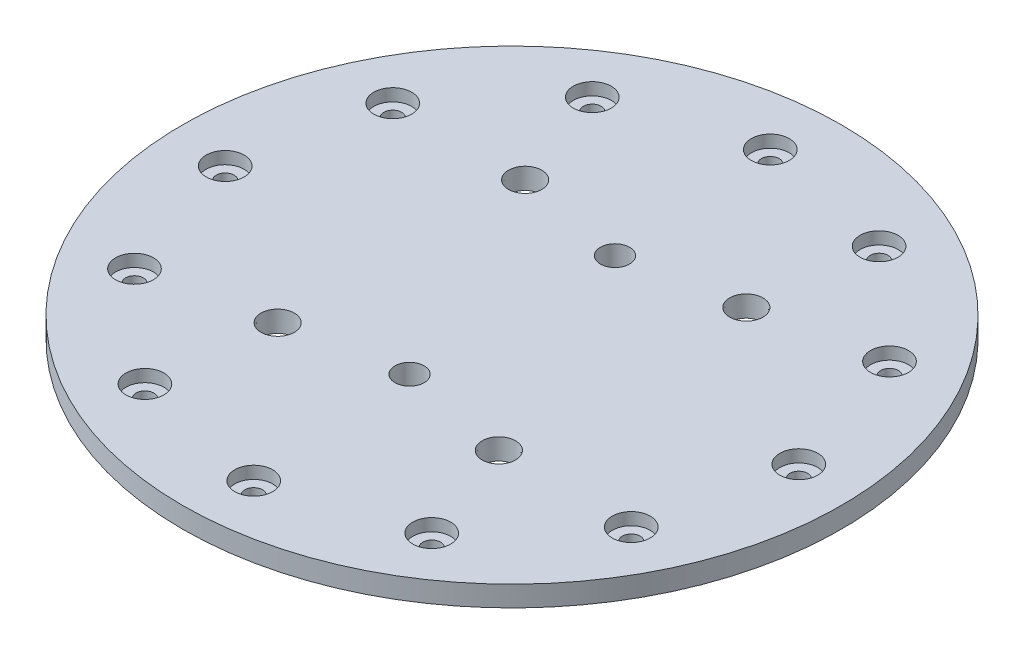
ISO-10303-21;
HEADER;
FILE_DESCRIPTION(('STEP AP214'),'2;1');
FILE_NAME('part.step','',(''),(''),'','','');
FILE_SCHEMA(('AUTOMOTIVE_DESIGN { 1 0 10303 214 1 1 1 1 }'));
ENDSEC;
DATA;
#1=APPLICATION_CONTEXT('core data for automotive mechanical design processes');
#2=APPLICATION_PROTOCOL_DEFINITION('international standard','automotive_design',2000,#1);
#3=PRODUCT_CONTEXT('',#1,'mechanical');
#4=PRODUCT('Part','Part','',(#3));
#5=PRODUCT_RELATED_PRODUCT_CATEGORY('part','',(#4));
#6=PRODUCT_DEFINITION_FORMATION('','',#4);
#7=PRODUCT_DEFINITION_CONTEXT('part definition',#1,'design');
#8=PRODUCT_DEFINITION('design','',#6,#7);
#9=PRODUCT_DEFINITION_SHAPE('','',#8);
#10=(LENGTH_UNIT() NAMED_UNIT(*) SI_UNIT(.MILLI.,.METRE.));
#11=(NAMED_UNIT(*) PLANE_ANGLE_UNIT() SI_UNIT($,.RADIAN.));
#12=(NAMED_UNIT(*) SI_UNIT($,.STERADIAN.) SOLID_ANGLE_UNIT());
#13=UNCERTAINTY_MEASURE_WITH_UNIT(LENGTH_MEASURE(1.E-05),#10,'distance_accuracy_value','');
#14=(GEOMETRIC_REPRESENTATION_CONTEXT(3) GLOBAL_UNCERTAINTY_ASSIGNED_CONTEXT((#13)) GLOBAL_UNIT_ASSIGNED_CONTEXT((#10,
#11,#12)) REPRESENTATION_CONTEXT('',''));
#15=CARTESIAN_POINT('',(0.,0.,0.));
#16=DIRECTION('',(0.,0.,1.));
#17=DIRECTION('',(1.,0.,0.));
#18=AXIS2_PLACEMENT_3D('',#15,#16,#17);
#19=CARTESIAN_POINT('',(0.,0.,0.));
#20=DIRECTION('',(0.,1.,0.));
#21=DIRECTION('',(0.,0.,1.));
#22=AXIS2_PLACEMENT_3D('',#19,#20,#21);
#23=PLANE('',#22);
#24=CARTESIAN_POINT('',(0.,0.,-31.75));
#25=DIRECTION('',(0.,1.,0.));
#26=DIRECTION('',(0.,0.,1.));
#27=AXIS2_PLACEMENT_3D('',#24,#25,#26);
#28=CIRCLE('',#27,4.5);
#29=CARTESIAN_POINT('',(0.,0.,-27.25));
#30=VERTEX_POINT('',#29);
#31=EDGE_CURVE('E220',#30,#30,#28,.T.);
#32=ORIENTED_EDGE('',*,*,#31,.T.);
#33=EDGE_LOOP('',(#32));
#34=FACE_BOUND('',#33,.T.);
#35=CARTESIAN_POINT('',(0.,0.,31.581589408944));
#36=DIRECTION('',(0.,1.,0.));
#37=DIRECTION('',(0.,0.,1.));
#38=AXIS2_PLACEMENT_3D('',#35,#36,#37);
#39=CIRCLE('',#38,4.5);
#40=CARTESIAN_POINT('',(0.,0.,36.081589408944));
#41=VERTEX_POINT('',#40);
#42=EDGE_CURVE('E214',#41,#41,#39,.T.);
#43=ORIENTED_EDGE('',*,*,#42,.T.);
#44=EDGE_LOOP('',(#43));
#45=FACE_BOUND('',#44,.T.);
#46=CARTESIAN_POINT('',(-34.0944945680612,0.,-38.1467090863964));
#47=DIRECTION('',(0.,1.,0.));
#48=DIRECTION('',(0.,0.,1.));
#49=AXIS2_PLACEMENT_3D('',#46,#47,#48);
#50=CIRCLE('',#49,4.95139129626713);
#51=CARTESIAN_POINT('',(-34.0944945680612,0.,-33.1953177901293));
#52=VERTEX_POINT('',#51);
#53=EDGE_CURVE('E208',#52,#52,#50,.T.);
#54=ORIENTED_EDGE('',*,*,#53,.T.);
#55=EDGE_LOOP('',(#54));
#56=FACE_BOUND('',#55,.T.);
#57=CARTESIAN_POINT('',(34.0944945680612,0.,-38.1467090863964));
#58=DIRECTION('',(0.,1.,0.));
#59=DIRECTION('',(0.,0.,1.));
#60=AXIS2_PLACEMENT_3D('',#57,#58,#59);
#61=CIRCLE('',#60,4.95139129626713);
#62=CARTESIAN_POINT('',(34.0944945680612,0.,-33.1953177901293));
#63=VERTEX_POINT('',#62);
#64=EDGE_CURVE('E202',#63,#63,#61,.T.);
#65=ORIENTED_EDGE('',*,*,#64,.T.);
#66=EDGE_LOOP('',(#65));
#67=FACE_BOUND('',#66,.T.);
#68=CARTESIAN_POINT('',(34.0944945680612,0.,38.1467090863964));
#69=DIRECTION('',(0.,1.,0.));
#70=DIRECTION('',(0.,0.,1.));
#71=AXIS2_PLACEMENT_3D('',#68,#69,#70);
#72=CIRCLE('',#71,4.95139129626713);
#73=CARTESIAN_POINT('',(34.0944945680612,0.,43.0981003826635));
#74=VERTEX_POINT('',#73);
#75=EDGE_CURVE('E196',#74,#74,#72,.T.);
#76=ORIENTED_EDGE('',*,*,#75,.T.);
#77=EDGE_LOOP('',(#76));
#78=FACE_BOUND('',#77,.T.);
#79=CARTESIAN_POINT('',(-34.0944945680612,0.,38.1467090863964));
#80=DIRECTION('',(0.,1.,0.));
#81=DIRECTION('',(0.,0.,1.));
#82=AXIS2_PLACEMENT_3D('',#79,#80,#81);
#83=CIRCLE('',#82,4.95139129626713);
#84=CARTESIAN_POINT('',(-34.0944945680612,0.,43.0981003826635));
#85=VERTEX_POINT('',#84);
#86=EDGE_CURVE('E39',#85,#85,#83,.T.);
#87=ORIENTED_EDGE('',*,*,#86,.T.);
#88=EDGE_LOOP('',(#87));
#89=FACE_BOUND('',#88,.T.);
#90=CARTESIAN_POINT('',(-45.8207224881937,0.,-70.5661412924777));
#91=DIRECTION('',(0.,1.,0.));
#92=DIRECTION('',(0.,0.,1.));
#93=AXIS2_PLACEMENT_3D('',#90,#91,#92);
#94=CIRCLE('',#93,2.75);
#95=CARTESIAN_POINT('',(-45.8207224881937,0.,-67.8161412924777));
#96=VERTEX_POINT('',#95);
#97=EDGE_CURVE('E181',#96,#96,#94,.T.);
#98=ORIENTED_EDGE('',*,*,#97,.T.);
#99=EDGE_LOOP('',(#98));
#100=FACE_BOUND('',#99,.T.);
#101=CARTESIAN_POINT('',(-4.39883904829373,0.,-84.0224322504247));
#102=DIRECTION('',(0.,1.,0.));
#103=DIRECTION('',(0.,0.,1.));
#104=AXIS2_PLACEMENT_3D('',#101,#102,#103);
#105=CIRCLE('',#104,2.75);
#106=CARTESIAN_POINT('',(-4.39883904829373,0.,-81.2724322504247));
#107=VERTEX_POINT('',#106);
#108=EDGE_CURVE('E169',#107,#107,#105,.T.);
#109=ORIENTED_EDGE('',*,*,#108,.T.);
#110=EDGE_LOOP('',(#109));
#111=FACE_BOUND('',#110,.T.);
#112=CARTESIAN_POINT('',(38.2017097622311,0.,-74.9649803407715));
#113=DIRECTION('',(0.,1.,0.));
#114=DIRECTION('',(0.,0.,1.));
#115=AXIS2_PLACEMENT_3D('',#112,#113,#114);
#116=CIRCLE('',#115,2.75);
#117=CARTESIAN_POINT('',(38.2017097622311,0.,-72.2149803407715));
#118=VERTEX_POINT('',#117);
#119=EDGE_CURVE('E157',#118,#118,#116,.T.);
#120=ORIENTED_EDGE('',*,*,#119,.T.);
#121=EDGE_LOOP('',(#120));
#122=FACE_BOUND('',#121,.T.);
#123=CARTESIAN_POINT('',(70.5661412924779,0.,-45.8207224881935));
#124=DIRECTION('',(0.,1.,0.));
#125=DIRECTION('',(0.,0.,1.));
#126=AXIS2_PLACEMENT_3D('',#123,#124,#125);
#127=CIRCLE('',#126,2.75);
#128=CARTESIAN_POINT('',(70.5661412924779,0.,-43.0707224881935));
#129=VERTEX_POINT('',#128);
#130=EDGE_CURVE('E145',#129,#129,#127,.T.);
#131=ORIENTED_EDGE('',*,*,#130,.T.);
#132=EDGE_LOOP('',(#131));
#133=FACE_BOUND('',#132,.T.);
#134=CARTESIAN_POINT('',(84.0224322504247,0.,-4.39883904829343));
#135=DIRECTION('',(0.,1.,0.));
#136=DIRECTION('',(0.,0.,1.));
#137=AXIS2_PLACEMENT_3D('',#134,#135,#136);
#138=CIRCLE('',#137,2.75);
#139=CARTESIAN_POINT('',(84.0224322504247,0.,-1.64883904829343));
#140=VERTEX_POINT('',#139);
#141=EDGE_CURVE('E133',#140,#140,#138,.T.);
#142=ORIENTED_EDGE('',*,*,#141,.T.);
#143=EDGE_LOOP('',(#142));
#144=FACE_BOUND('',#143,.T.);
#145=CARTESIAN_POINT('',(74.9649803407711,0.,38.2017097622319));
#146=DIRECTION('',(0.,1.,0.));
#147=DIRECTION('',(0.,0.,1.));
#148=AXIS2_PLACEMENT_3D('',#145,#146,#147);
#149=CIRCLE('',#148,2.75);
#150=CARTESIAN_POINT('',(74.9649803407711,0.,40.9517097622319));
#151=VERTEX_POINT('',#150);
#152=EDGE_CURVE('E121',#151,#151,#149,.T.);
#153=ORIENTED_EDGE('',*,*,#152,.T.);
#154=EDGE_LOOP('',(#153));
#155=FACE_BOUND('',#154,.T.);
#156=CARTESIAN_POINT('',(45.8207224881932,0.,70.5661412924781));
#157=DIRECTION('',(0.,1.,0.));
#158=DIRECTION('',(0.,0.,1.));
#159=AXIS2_PLACEMENT_3D('',#156,#157,#158);
#160=CIRCLE('',#159,2.75);
#161=CARTESIAN_POINT('',(45.8207224881932,0.,73.3161412924781));
#162=VERTEX_POINT('',#161);
#163=EDGE_CURVE('E109',#162,#162,#160,.T.);
#164=ORIENTED_EDGE('',*,*,#163,.T.);
#165=EDGE_LOOP('',(#164));
#166=FACE_BOUND('',#165,.T.);
#167=CARTESIAN_POINT('',(4.39883904829314,0.,84.0224322504247));
#168=DIRECTION('',(0.,1.,0.));
#169=DIRECTION('',(0.,0.,1.));
#170=AXIS2_PLACEMENT_3D('',#167,#168,#169);
#171=CIRCLE('',#170,2.75);
#172=CARTESIAN_POINT('',(4.39883904829314,0.,86.7724322504247));
#173=VERTEX_POINT('',#172);
#174=EDGE_CURVE('E97',#173,#173,#171,.T.);
#175=ORIENTED_EDGE('',*,*,#174,.T.);
#176=EDGE_LOOP('',(#175));
#177=FACE_BOUND('',#176,.T.);
#178=CARTESIAN_POINT('',(-38.2017097622316,0.,74.9649803407712));
#179=DIRECTION('',(0.,1.,0.));
#180=DIRECTION('',(0.,0.,1.));
#181=AXIS2_PLACEMENT_3D('',#178,#179,#180);
#182=CIRCLE('',#181,2.75);
#183=CARTESIAN_POINT('',(-38.2017097622316,0.,77.7149803407712));
#184=VERTEX_POINT('',#183);
#185=EDGE_CURVE('E85',#184,#184,#182,.T.);
#186=ORIENTED_EDGE('',*,*,#185,.T.);
#187=EDGE_LOOP('',(#186));
#188=FACE_BOUND('',#187,.T.);
#189=CARTESIAN_POINT('',(-70.5661412924782,0.,45.820722488193));
#190=DIRECTION('',(0.,1.,0.));
#191=DIRECTION('',(0.,0.,1.));
#192=AXIS2_PLACEMENT_3D('',#189,#190,#191);
#193=CIRCLE('',#192,2.75);
#194=CARTESIAN_POINT('',(-70.5661412924782,0.,48.570722488193));
#195=VERTEX_POINT('',#194);
#196=EDGE_CURVE('E73',#195,#195,#193,.T.);
#197=ORIENTED_EDGE('',*,*,#196,.T.);
#198=EDGE_LOOP('',(#197));
#199=FACE_BOUND('',#198,.T.);
#200=CARTESIAN_POINT('',(-84.0224322504247,0.,4.39883904829285));
#201=DIRECTION('',(0.,1.,0.));
#202=DIRECTION('',(0.,0.,1.));
#203=AXIS2_PLACEMENT_3D('',#200,#201,#202);
#204=CIRCLE('',#203,2.75);
#205=CARTESIAN_POINT('',(-84.0224322504247,0.,7.14883904829285));
#206=VERTEX_POINT('',#205);
#207=EDGE_CURVE('E61',#206,#206,#204,.T.);
#208=ORIENTED_EDGE('',*,*,#207,.T.);
#209=EDGE_LOOP('',(#208));
#210=FACE_BOUND('',#209,.T.);
#211=CARTESIAN_POINT('',(-74.9649803407711,0.,-38.2017097622319));
#212=DIRECTION('',(0.,1.,0.));
#213=DIRECTION('',(0.,0.,1.));
#214=AXIS2_PLACEMENT_3D('',#211,#212,#213);
#215=CIRCLE('',#214,2.75);
#216=CARTESIAN_POINT('',(-74.9649803407711,0.,-35.4517097622319));
#217=VERTEX_POINT('',#216);
#218=EDGE_CURVE('E48',#217,#217,#215,.T.);
#219=ORIENTED_EDGE('',*,*,#218,.T.);
#220=EDGE_LOOP('',(#219));
#221=FACE_BOUND('',#220,.T.);
#222=CARTESIAN_POINT('',(0.,0.,0.));
#223=DIRECTION('',(0.,1.,0.));
#224=DIRECTION('',(0.,0.,1.));
#225=AXIS2_PLACEMENT_3D('',#222,#223,#224);
#226=CIRCLE('',#225,101.6);
#227=CARTESIAN_POINT('',(0.,0.,101.6));
#228=VERTEX_POINT('',#227);
#229=EDGE_CURVE('E43',#228,#228,#226,.T.);
#230=ORIENTED_EDGE('',*,*,#229,.F.);
#231=EDGE_LOOP('',(#230));
#232=FACE_BOUND('',#231,.T.);
#233=ADVANCED_FACE('F35',(#34,#45,#56,#67,#78,#89,#100,#111,#122,#133,#144,#155,#166,#177,#188,
#199,#210,#221,#232),#23,.F.);
#234=CARTESIAN_POINT('',(0.,6.35,0.));
#235=DIRECTION('',(0.,1.,0.));
#236=DIRECTION('',(0.,0.,1.));
#237=AXIS2_PLACEMENT_3D('',#234,#235,#236);
#238=PLANE('',#237);
#239=CARTESIAN_POINT('',(0.,6.35,-31.75));
#240=DIRECTION('',(0.,1.,0.));
#241=DIRECTION('',(0.,0.,1.));
#242=AXIS2_PLACEMENT_3D('',#239,#240,#241);
#243=CIRCLE('',#242,4.5);
#244=CARTESIAN_POINT('',(0.,6.35,-27.25));
#245=VERTEX_POINT('',#244);
#246=EDGE_CURVE('E223',#245,#245,#243,.T.);
#247=ORIENTED_EDGE('',*,*,#246,.F.);
#248=EDGE_LOOP('',(#247));
#249=FACE_BOUND('',#248,.T.);
#250=CARTESIAN_POINT('',(0.,6.35,31.581589408944));
#251=DIRECTION('',(0.,1.,0.));
#252=DIRECTION('',(0.,0.,1.));
#253=AXIS2_PLACEMENT_3D('',#250,#251,#252);
#254=CIRCLE('',#253,4.5);
#255=CARTESIAN_POINT('',(0.,6.35,36.081589408944));
#256=VERTEX_POINT('',#255);
#257=EDGE_CURVE('E217',#256,#256,#254,.T.);
#258=ORIENTED_EDGE('',*,*,#257,.F.);
#259=EDGE_LOOP('',(#258));
#260=FACE_BOUND('',#259,.T.);
#261=CARTESIAN_POINT('',(-34.0944945680612,6.35,-38.1467090863964));
#262=DIRECTION('',(0.,1.,0.));
#263=DIRECTION('',(0.,0.,1.));
#264=AXIS2_PLACEMENT_3D('',#261,#262,#263);
#265=CIRCLE('',#264,5.1415188);
#266=CARTESIAN_POINT('',(-34.0944945680612,6.35,-33.0051902863964));
#267=VERTEX_POINT('',#266);
#268=EDGE_CURVE('E211',#267,#267,#265,.T.);
#269=ORIENTED_EDGE('',*,*,#268,.F.);
#270=EDGE_LOOP('',(#269));
#271=FACE_BOUND('',#270,.T.);
#272=CARTESIAN_POINT('',(34.0944945680612,6.35,-38.1467090863964));
#273=DIRECTION('',(0.,1.,0.));
#274=DIRECTION('',(0.,0.,1.));
#275=AXIS2_PLACEMENT_3D('',#272,#273,#274);
#276=CIRCLE('',#275,5.1415188);
#277=CARTESIAN_POINT('',(34.0944945680612,6.35,-33.0051902863964));
#278=VERTEX_POINT('',#277);
#279=EDGE_CURVE('E205',#278,#278,#276,.T.);
#280=ORIENTED_EDGE('',*,*,#279,.F.);
#281=EDGE_LOOP('',(#280));
#282=FACE_BOUND('',#281,.T.);
#283=CARTESIAN_POINT('',(34.0944945680612,6.35,38.1467090863964));
#284=DIRECTION('',(0.,1.,0.));
#285=DIRECTION('',(0.,0.,1.));
#286=AXIS2_PLACEMENT_3D('',#283,#284,#285);
#287=CIRCLE('',#286,5.1415188);
#288=CARTESIAN_POINT('',(34.0944945680612,6.35,43.2882278863964));
#289=VERTEX_POINT('',#288);
#290=EDGE_CURVE('E199',#289,#289,#287,.T.);
#291=ORIENTED_EDGE('',*,*,#290,.F.);
#292=EDGE_LOOP('',(#291));
#293=FACE_BOUND('',#292,.T.);
#294=CARTESIAN_POINT('',(-34.0944945680612,6.35,38.1467090863964));
#295=DIRECTION('',(0.,1.,0.));
#296=DIRECTION('',(0.,0.,1.));
#297=AXIS2_PLACEMENT_3D('',#294,#295,#296);
#298=CIRCLE('',#297,5.1415188);
#299=CARTESIAN_POINT('',(-34.0944945680612,6.35,43.2882278863964));
#300=VERTEX_POINT('',#299);
#301=EDGE_CURVE('E193',#300,#300,#298,.T.);
#302=ORIENTED_EDGE('',*,*,#301,.F.);
#303=EDGE_LOOP('',(#302));
#304=FACE_BOUND('',#303,.T.);
#305=CARTESIAN_POINT('',(-45.8207224881937,6.35,-70.5661412924777));
#306=DIRECTION('',(0.,1.,0.));
#307=DIRECTION('',(0.,0.,1.));
#308=AXIS2_PLACEMENT_3D('',#305,#306,#307);
#309=CIRCLE('',#308,5.855);
#310=CARTESIAN_POINT('',(-45.8207224881937,6.35,-64.7111412924777));
#311=VERTEX_POINT('',#310);
#312=EDGE_CURVE('E190',#311,#311,#309,.T.);
#313=ORIENTED_EDGE('',*,*,#312,.F.);
#314=EDGE_LOOP('',(#313));
#315=FACE_BOUND('',#314,.T.);
#316=CARTESIAN_POINT('',(-4.39883904829373,6.35,-84.0224322504247));
#317=DIRECTION('',(0.,1.,0.));
#318=DIRECTION('',(0.,0.,1.));
#319=AXIS2_PLACEMENT_3D('',#316,#317,#318);
#320=CIRCLE('',#319,5.855);
#321=CARTESIAN_POINT('',(-4.39883904829373,6.35,-78.1674322504247));
#322=VERTEX_POINT('',#321);
#323=EDGE_CURVE('E178',#322,#322,#320,.T.);
#324=ORIENTED_EDGE('',*,*,#323,.F.);
#325=EDGE_LOOP('',(#324));
#326=FACE_BOUND('',#325,.T.);
#327=CARTESIAN_POINT('',(38.2017097622311,6.35,-74.9649803407715));
#328=DIRECTION('',(0.,1.,0.));
#329=DIRECTION('',(0.,0.,1.));
#330=AXIS2_PLACEMENT_3D('',#327,#328,#329);
#331=CIRCLE('',#330,5.85499999999999);
#332=CARTESIAN_POINT('',(38.2017097622311,6.35,-69.1099803407715));
#333=VERTEX_POINT('',#332);
#334=EDGE_CURVE('E166',#333,#333,#331,.T.);
#335=ORIENTED_EDGE('',*,*,#334,.F.);
#336=EDGE_LOOP('',(#335));
#337=FACE_BOUND('',#336,.T.);
#338=CARTESIAN_POINT('',(70.5661412924779,6.35,-45.8207224881935));
#339=DIRECTION('',(0.,1.,0.));
#340=DIRECTION('',(0.,0.,1.));
#341=AXIS2_PLACEMENT_3D('',#338,#339,#340);
#342=CIRCLE('',#341,5.855);
#343=CARTESIAN_POINT('',(70.5661412924779,6.35,-39.9657224881935));
#344=VERTEX_POINT('',#343);
#345=EDGE_CURVE('E154',#344,#344,#342,.T.);
#346=ORIENTED_EDGE('',*,*,#345,.F.);
#347=EDGE_LOOP('',(#346));
#348=FACE_BOUND('',#347,.T.);
#349=CARTESIAN_POINT('',(84.0224322504247,6.35,-4.39883904829343));
#350=DIRECTION('',(0.,1.,0.));
#351=DIRECTION('',(0.,0.,1.));
#352=AXIS2_PLACEMENT_3D('',#349,#350,#351);
#353=CIRCLE('',#352,5.855);
#354=CARTESIAN_POINT('',(84.0224322504247,6.35,1.45616095170657));
#355=VERTEX_POINT('',#354);
#356=EDGE_CURVE('E142',#355,#355,#353,.T.);
#357=ORIENTED_EDGE('',*,*,#356,.F.);
#358=EDGE_LOOP('',(#357));
#359=FACE_BOUND('',#358,.T.);
#360=CARTESIAN_POINT('',(74.9649803407711,6.35,38.2017097622319));
#361=DIRECTION('',(0.,1.,0.));
#362=DIRECTION('',(0.,0.,1.));
#363=AXIS2_PLACEMENT_3D('',#360,#361,#362);
#364=CIRCLE('',#363,5.855);
#365=CARTESIAN_POINT('',(74.9649803407711,6.35,44.0567097622319));
#366=VERTEX_POINT('',#365);
#367=EDGE_CURVE('E130',#366,#366,#364,.T.);
#368=ORIENTED_EDGE('',*,*,#367,.F.);
#369=EDGE_LOOP('',(#368));
#370=FACE_BOUND('',#369,.T.);
#371=CARTESIAN_POINT('',(45.8207224881932,6.35,70.5661412924781));
#372=DIRECTION('',(0.,1.,0.));
#373=DIRECTION('',(0.,0.,1.));
#374=AXIS2_PLACEMENT_3D('',#371,#372,#373);
#375=CIRCLE('',#374,5.85499999999999);
#376=CARTESIAN_POINT('',(45.8207224881932,6.35,76.4211412924781));
#377=VERTEX_POINT('',#376);
#378=EDGE_CURVE('E118',#377,#377,#375,.T.);
#379=ORIENTED_EDGE('',*,*,#378,.F.);
#380=EDGE_LOOP('',(#379));
#381=FACE_BOUND('',#380,.T.);
#382=CARTESIAN_POINT('',(4.39883904829314,6.35,84.0224322504247));
#383=DIRECTION('',(0.,1.,0.));
#384=DIRECTION('',(0.,0.,1.));
#385=AXIS2_PLACEMENT_3D('',#382,#383,#384);
#386=CIRCLE('',#385,5.855);
#387=CARTESIAN_POINT('',(4.39883904829314,6.35,89.8774322504247));
#388=VERTEX_POINT('',#387);
#389=EDGE_CURVE('E106',#388,#388,#386,.T.);
#390=ORIENTED_EDGE('',*,*,#389,.F.);
#391=EDGE_LOOP('',(#390));
#392=FACE_BOUND('',#391,.T.);
#393=CARTESIAN_POINT('',(-38.2017097622316,6.35,74.9649803407712));
#394=DIRECTION('',(0.,1.,0.));
#395=DIRECTION('',(0.,0.,1.));
#396=AXIS2_PLACEMENT_3D('',#393,#394,#395);
#397=CIRCLE('',#396,5.855);
#398=CARTESIAN_POINT('',(-38.2017097622316,6.35,80.8199803407712));
#399=VERTEX_POINT('',#398);
#400=EDGE_CURVE('E94',#399,#399,#397,.T.);
#401=ORIENTED_EDGE('',*,*,#400,.F.);
#402=EDGE_LOOP('',(#401));
#403=FACE_BOUND('',#402,.T.);
#404=CARTESIAN_POINT('',(-70.5661412924782,6.35,45.820722488193));
#405=DIRECTION('',(0.,1.,0.));
#406=DIRECTION('',(0.,0.,1.));
#407=AXIS2_PLACEMENT_3D('',#404,#405,#406);
#408=CIRCLE('',#407,5.855);
#409=CARTESIAN_POINT('',(-70.5661412924782,6.35,51.675722488193));
#410=VERTEX_POINT('',#409);
#411=EDGE_CURVE('E82',#410,#410,#408,.T.);
#412=ORIENTED_EDGE('',*,*,#411,.F.);
#413=EDGE_LOOP('',(#412));
#414=FACE_BOUND('',#413,.T.);
#415=CARTESIAN_POINT('',(-84.0224322504247,6.35,4.39883904829285));
#416=DIRECTION('',(0.,1.,0.));
#417=DIRECTION('',(0.,0.,1.));
#418=AXIS2_PLACEMENT_3D('',#415,#416,#417);
#419=CIRCLE('',#418,5.855);
#420=CARTESIAN_POINT('',(-84.0224322504247,6.35,10.2538390482928));
#421=VERTEX_POINT('',#420);
#422=EDGE_CURVE('E70',#421,#421,#419,.T.);
#423=ORIENTED_EDGE('',*,*,#422,.F.);
#424=EDGE_LOOP('',(#423));
#425=FACE_BOUND('',#424,.T.);
#426=CARTESIAN_POINT('',(-74.9649803407711,6.35,-38.2017097622319));
#427=DIRECTION('',(0.,1.,0.));
#428=DIRECTION('',(0.,0.,1.));
#429=AXIS2_PLACEMENT_3D('',#426,#427,#428);
#430=CIRCLE('',#429,5.855);
#431=CARTESIAN_POINT('',(-74.9649803407711,6.35,-32.3467097622319));
#432=VERTEX_POINT('',#431);
#433=EDGE_CURVE('E58',#432,#432,#430,.T.);
#434=ORIENTED_EDGE('',*,*,#433,.F.);
#435=EDGE_LOOP('',(#434));
#436=FACE_BOUND('',#435,.T.);
#437=CARTESIAN_POINT('',(0.,6.35,0.));
#438=DIRECTION('',(0.,1.,0.));
#439=DIRECTION('',(0.,0.,1.));
#440=AXIS2_PLACEMENT_3D('',#437,#438,#439);
#441=CIRCLE('',#440,101.6);
#442=CARTESIAN_POINT('',(0.,6.35,101.6));
#443=VERTEX_POINT('',#442);
#444=EDGE_CURVE('E10',#443,#443,#441,.T.);
#445=ORIENTED_EDGE('',*,*,#444,.T.);
#446=EDGE_LOOP('',(#445));
#447=FACE_BOUND('',#446,.T.);
#448=ADVANCED_FACE('F230',(#249,#260,#271,#282,#293,#304,#315,#326,#337,#348,#359,#370,#381,
#392,#403,#414,#425,#436,#447),#238,.T.);
#449=CARTESIAN_POINT('',(0.,6.35,0.));
#450=DIRECTION('',(0.,-1.,0.));
#451=DIRECTION('',(0.,0.,-1.));
#452=AXIS2_PLACEMENT_3D('',#449,#450,#451);
#453=CYLINDRICAL_SURFACE('',#452,101.6);
#454=ORIENTED_EDGE('',*,*,#444,.F.);
#455=EDGE_LOOP('',(#454));
#456=FACE_BOUND('',#455,.T.);
#457=ORIENTED_EDGE('',*,*,#229,.T.);
#458=EDGE_LOOP('',(#457));
#459=FACE_BOUND('',#458,.T.);
#460=ADVANCED_FACE('F37',(#456,#459),#453,.T.);
#461=CARTESIAN_POINT('',(-74.9649803407711,6.35,-38.2017097622319));
#462=DIRECTION('',(0.,1.,0.));
#463=DIRECTION('',(0.,0.,1.));
#464=AXIS2_PLACEMENT_3D('',#461,#462,#463);
#465=CYLINDRICAL_SURFACE('',#464,2.75);
#466=ORIENTED_EDGE('',*,*,#218,.F.);
#467=EDGE_LOOP('',(#466));
#468=FACE_BOUND('',#467,.T.);
#469=CARTESIAN_POINT('',(-74.9649803407711,2.55,-38.2017097622319));
#470=DIRECTION('',(0.,1.,0.));
#471=DIRECTION('',(0.,0.,1.));
#472=AXIS2_PLACEMENT_3D('',#469,#470,#471);
#473=CIRCLE('',#472,2.75);
#474=CARTESIAN_POINT('',(-74.9649803407711,2.55,-35.4517097622319));
#475=VERTEX_POINT('',#474);
#476=EDGE_CURVE('E52',#475,#475,#473,.T.);
#477=ORIENTED_EDGE('',*,*,#476,.T.);
#478=EDGE_LOOP('',(#477));
#479=FACE_BOUND('',#478,.T.);
#480=ADVANCED_FACE('F281',(#468,#479),#465,.F.);
#481=CARTESIAN_POINT('',(-72.2149803407711,2.55,-38.2017097622319));
#482=DIRECTION('',(0.,-1.,0.));
#483=DIRECTION('',(0.,0.,-1.));
#484=AXIS2_PLACEMENT_3D('',#481,#482,#483);
#485=PLANE('',#484);
#486=ORIENTED_EDGE('',*,*,#476,.F.);
#487=EDGE_LOOP('',(#486));
#488=FACE_BOUND('',#487,.T.);
#489=CARTESIAN_POINT('',(-74.9649803407711,2.55,-38.2017097622319));
#490=DIRECTION('',(0.,1.,0.));
#491=DIRECTION('',(0.,0.,1.));
#492=AXIS2_PLACEMENT_3D('',#489,#490,#491);
#493=CIRCLE('',#492,5.855);
#494=CARTESIAN_POINT('',(-74.9649803407711,2.55,-32.3467097622319));
#495=VERTEX_POINT('',#494);
#496=EDGE_CURVE('E55',#495,#495,#493,.T.);
#497=ORIENTED_EDGE('',*,*,#496,.T.);
#498=EDGE_LOOP('',(#497));
#499=FACE_BOUND('',#498,.T.);
#500=ADVANCED_FACE('F271',(#488,#499),#485,.F.);
#501=CARTESIAN_POINT('',(-74.9649803407711,6.35,-38.2017097622319));
#502=DIRECTION('',(0.,1.,0.));
#503=DIRECTION('',(0.,0.,1.));
#504=AXIS2_PLACEMENT_3D('',#501,#502,#503);
#505=CYLINDRICAL_SURFACE('',#504,5.855);
#506=ORIENTED_EDGE('',*,*,#496,.F.);
#507=EDGE_LOOP('',(#506));
#508=FACE_BOUND('',#507,.T.);
#509=ORIENTED_EDGE('',*,*,#433,.T.);
#510=EDGE_LOOP('',(#509));
#511=FACE_BOUND('',#510,.T.);
#512=ADVANCED_FACE('F268',(#508,#511),#505,.F.);
#513=CARTESIAN_POINT('',(-84.0224322504247,6.35,4.39883904829285));
#514=DIRECTION('',(0.,1.,0.));
#515=DIRECTION('',(0.,0.,1.));
#516=AXIS2_PLACEMENT_3D('',#513,#514,#515);
#517=CYLINDRICAL_SURFACE('',#516,2.75);
#518=ORIENTED_EDGE('',*,*,#207,.F.);
#519=EDGE_LOOP('',(#518));
#520=FACE_BOUND('',#519,.T.);
#521=CARTESIAN_POINT('',(-84.0224322504247,2.55,4.39883904829285));
#522=DIRECTION('',(0.,1.,0.));
#523=DIRECTION('',(0.,0.,1.));
#524=AXIS2_PLACEMENT_3D('',#521,#522,#523);
#525=CIRCLE('',#524,2.75);
#526=CARTESIAN_POINT('',(-84.0224322504247,2.55,7.14883904829285));
#527=VERTEX_POINT('',#526);
#528=EDGE_CURVE('E64',#527,#527,#525,.T.);
#529=ORIENTED_EDGE('',*,*,#528,.T.);
#530=EDGE_LOOP('',(#529));
#531=FACE_BOUND('',#530,.T.);
#532=ADVANCED_FACE('F270',(#520,#531),#517,.F.);
#533=CARTESIAN_POINT('',(-81.2724322504247,2.55,4.39883904829285));
#534=DIRECTION('',(0.,-1.,0.));
#535=DIRECTION('',(0.,0.,-1.));
#536=AXIS2_PLACEMENT_3D('',#533,#534,#535);
#537=PLANE('',#536);
#538=ORIENTED_EDGE('',*,*,#528,.F.);
#539=EDGE_LOOP('',(#538));
#540=FACE_BOUND('',#539,.T.);
#541=CARTESIAN_POINT('',(-84.0224322504247,2.55,4.39883904829285));
#542=DIRECTION('',(0.,1.,0.));
#543=DIRECTION('',(0.,0.,1.));
#544=AXIS2_PLACEMENT_3D('',#541,#542,#543);
#545=CIRCLE('',#544,5.855);
#546=CARTESIAN_POINT('',(-84.0224322504247,2.55,10.2538390482928));
#547=VERTEX_POINT('',#546);
#548=EDGE_CURVE('E67',#547,#547,#545,.T.);
#549=ORIENTED_EDGE('',*,*,#548,.T.);
#550=EDGE_LOOP('',(#549));
#551=FACE_BOUND('',#550,.T.);
#552=ADVANCED_FACE('F278',(#540,#551),#537,.F.);
#553=CARTESIAN_POINT('',(-84.0224322504247,6.35,4.39883904829285));
#554=DIRECTION('',(0.,1.,0.));
#555=DIRECTION('',(0.,0.,1.));
#556=AXIS2_PLACEMENT_3D('',#553,#554,#555);
#557=CYLINDRICAL_SURFACE('',#556,5.855);
#558=ORIENTED_EDGE('',*,*,#548,.F.);
#559=EDGE_LOOP('',(#558));
#560=FACE_BOUND('',#559,.T.);
#561=ORIENTED_EDGE('',*,*,#422,.T.);
#562=EDGE_LOOP('',(#561));
#563=FACE_BOUND('',#562,.T.);
#564=ADVANCED_FACE('F600',(#560,#563),#557,.F.);
#565=CARTESIAN_POINT('',(-70.5661412924782,6.35,45.820722488193));
#566=DIRECTION('',(0.,1.,0.));
#567=DIRECTION('',(0.,0.,1.));
#568=AXIS2_PLACEMENT_3D('',#565,#566,#567);
#569=CYLINDRICAL_SURFACE('',#568,2.75);
#570=ORIENTED_EDGE('',*,*,#196,.F.);
#571=EDGE_LOOP('',(#570));
#572=FACE_BOUND('',#571,.T.);
#573=CARTESIAN_POINT('',(-70.5661412924782,2.55,45.820722488193));
#574=DIRECTION('',(0.,1.,0.));
#575=DIRECTION('',(0.,0.,1.));
#576=AXIS2_PLACEMENT_3D('',#573,#574,#575);
#577=CIRCLE('',#576,2.75);
#578=CARTESIAN_POINT('',(-70.5661412924782,2.55,48.570722488193));
#579=VERTEX_POINT('',#578);
#580=EDGE_CURVE('E76',#579,#579,#577,.T.);
#581=ORIENTED_EDGE('',*,*,#580,.T.);
#582=EDGE_LOOP('',(#581));
#583=FACE_BOUND('',#582,.T.);
#584=ADVANCED_FACE('F592',(#572,#583),#569,.F.);
#585=CARTESIAN_POINT('',(-67.8161412924782,2.55,45.820722488193));
#586=DIRECTION('',(0.,-1.,0.));
#587=DIRECTION('',(0.,0.,-1.));
#588=AXIS2_PLACEMENT_3D('',#585,#586,#587);
#589=PLANE('',#588);
#590=ORIENTED_EDGE('',*,*,#580,.F.);
#591=EDGE_LOOP('',(#590));
#592=FACE_BOUND('',#591,.T.);
#593=CARTESIAN_POINT('',(-70.5661412924782,2.55,45.820722488193));
#594=DIRECTION('',(0.,1.,0.));
#595=DIRECTION('',(0.,0.,1.));
#596=AXIS2_PLACEMENT_3D('',#593,#594,#595);
#597=CIRCLE('',#596,5.855);
#598=CARTESIAN_POINT('',(-70.5661412924782,2.55,51.675722488193));
#599=VERTEX_POINT('',#598);
#600=EDGE_CURVE('E79',#599,#599,#597,.T.);
#601=ORIENTED_EDGE('',*,*,#600,.T.);
#602=EDGE_LOOP('',(#601));
#603=FACE_BOUND('',#602,.T.);
#604=ADVANCED_FACE('F584',(#592,#603),#589,.F.);
#605=CARTESIAN_POINT('',(-70.5661412924782,6.35,45.820722488193));
#606=DIRECTION('',(0.,1.,0.));
#607=DIRECTION('',(0.,0.,1.));
#608=AXIS2_PLACEMENT_3D('',#605,#606,#607);
#609=CYLINDRICAL_SURFACE('',#608,5.855);
#610=ORIENTED_EDGE('',*,*,#600,.F.);
#611=EDGE_LOOP('',(#610));
#612=FACE_BOUND('',#611,.T.);
#613=ORIENTED_EDGE('',*,*,#411,.T.);
#614=EDGE_LOOP('',(#613));
#615=FACE_BOUND('',#614,.T.);
#616=ADVANCED_FACE('F576',(#612,#615),#609,.F.);
#617=CARTESIAN_POINT('',(-38.2017097622316,6.35,74.9649803407712));
#618=DIRECTION('',(0.,1.,0.));
#619=DIRECTION('',(0.,0.,1.));
#620=AXIS2_PLACEMENT_3D('',#617,#618,#619);
#621=CYLINDRICAL_SURFACE('',#620,2.75);
#622=ORIENTED_EDGE('',*,*,#185,.F.);
#623=EDGE_LOOP('',(#622));
#624=FACE_BOUND('',#623,.T.);
#625=CARTESIAN_POINT('',(-38.2017097622316,2.55,74.9649803407712));
#626=DIRECTION('',(0.,1.,0.));
#627=DIRECTION('',(0.,0.,1.));
#628=AXIS2_PLACEMENT_3D('',#625,#626,#627);
#629=CIRCLE('',#628,2.75);
#630=CARTESIAN_POINT('',(-38.2017097622316,2.55,77.7149803407712));
#631=VERTEX_POINT('',#630);
#632=EDGE_CURVE('E88',#631,#631,#629,.T.);
#633=ORIENTED_EDGE('',*,*,#632,.T.);
#634=EDGE_LOOP('',(#633));
#635=FACE_BOUND('',#634,.T.);
#636=ADVANCED_FACE('F568',(#624,#635),#621,.F.);
#637=CARTESIAN_POINT('',(-35.4517097622316,2.55,74.9649803407712));
#638=DIRECTION('',(0.,-1.,0.));
#639=DIRECTION('',(0.,0.,-1.));
#640=AXIS2_PLACEMENT_3D('',#637,#638,#639);
#641=PLANE('',#640);
#642=ORIENTED_EDGE('',*,*,#632,.F.);
#643=EDGE_LOOP('',(#642));
#644=FACE_BOUND('',#643,.T.);
#645=CARTESIAN_POINT('',(-38.2017097622316,2.55,74.9649803407712));
#646=DIRECTION('',(0.,1.,0.));
#647=DIRECTION('',(0.,0.,1.));
#648=AXIS2_PLACEMENT_3D('',#645,#646,#647);
#649=CIRCLE('',#648,5.855);
#650=CARTESIAN_POINT('',(-38.2017097622316,2.55,80.8199803407712));
#651=VERTEX_POINT('',#650);
#652=EDGE_CURVE('E91',#651,#651,#649,.T.);
#653=ORIENTED_EDGE('',*,*,#652,.T.);
#654=EDGE_LOOP('',(#653));
#655=FACE_BOUND('',#654,.T.);
#656=ADVANCED_FACE('F560',(#644,#655),#641,.F.);
#657=CARTESIAN_POINT('',(-38.2017097622316,6.35,74.9649803407712));
#658=DIRECTION('',(0.,1.,0.));
#659=DIRECTION('',(0.,0.,1.));
#660=AXIS2_PLACEMENT_3D('',#657,#658,#659);
#661=CYLINDRICAL_SURFACE('',#660,5.855);
#662=ORIENTED_EDGE('',*,*,#652,.F.);
#663=EDGE_LOOP('',(#662));
#664=FACE_BOUND('',#663,.T.);
#665=ORIENTED_EDGE('',*,*,#400,.T.);
#666=EDGE_LOOP('',(#665));
#667=FACE_BOUND('',#666,.T.);
#668=ADVANCED_FACE('F552',(#664,#667),#661,.F.);
#669=CARTESIAN_POINT('',(4.39883904829314,6.35,84.0224322504247));
#670=DIRECTION('',(0.,1.,0.));
#671=DIRECTION('',(0.,0.,1.));
#672=AXIS2_PLACEMENT_3D('',#669,#670,#671);
#673=CYLINDRICAL_SURFACE('',#672,2.75);
#674=ORIENTED_EDGE('',*,*,#174,.F.);
#675=EDGE_LOOP('',(#674));
#676=FACE_BOUND('',#675,.T.);
#677=CARTESIAN_POINT('',(4.39883904829314,2.55,84.0224322504247));
#678=DIRECTION('',(0.,1.,0.));
#679=DIRECTION('',(0.,0.,1.));
#680=AXIS2_PLACEMENT_3D('',#677,#678,#679);
#681=CIRCLE('',#680,2.75);
#682=CARTESIAN_POINT('',(4.39883904829314,2.55,86.7724322504247));
#683=VERTEX_POINT('',#682);
#684=EDGE_CURVE('E100',#683,#683,#681,.T.);
#685=ORIENTED_EDGE('',*,*,#684,.T.);
#686=EDGE_LOOP('',(#685));
#687=FACE_BOUND('',#686,.T.);
#688=ADVANCED_FACE('F544',(#676,#687),#673,.F.);
#689=CARTESIAN_POINT('',(7.14883904829313,2.55,84.0224322504247));
#690=DIRECTION('',(0.,-1.,0.));
#691=DIRECTION('',(0.,0.,-1.));
#692=AXIS2_PLACEMENT_3D('',#689,#690,#691);
#693=PLANE('',#692);
#694=ORIENTED_EDGE('',*,*,#684,.F.);
#695=EDGE_LOOP('',(#694));
#696=FACE_BOUND('',#695,.T.);
#697=CARTESIAN_POINT('',(4.39883904829314,2.55,84.0224322504247));
#698=DIRECTION('',(0.,1.,0.));
#699=DIRECTION('',(0.,0.,1.));
#700=AXIS2_PLACEMENT_3D('',#697,#698,#699);
#701=CIRCLE('',#700,5.855);
#702=CARTESIAN_POINT('',(4.39883904829314,2.55,89.8774322504247));
#703=VERTEX_POINT('',#702);
#704=EDGE_CURVE('E103',#703,#703,#701,.T.);
#705=ORIENTED_EDGE('',*,*,#704,.T.);
#706=EDGE_LOOP('',(#705));
#707=FACE_BOUND('',#706,.T.);
#708=ADVANCED_FACE('F536',(#696,#707),#693,.F.);
#709=CARTESIAN_POINT('',(4.39883904829314,6.35,84.0224322504247));
#710=DIRECTION('',(0.,1.,0.));
#711=DIRECTION('',(0.,0.,1.));
#712=AXIS2_PLACEMENT_3D('',#709,#710,#711);
#713=CYLINDRICAL_SURFACE('',#712,5.855);
#714=ORIENTED_EDGE('',*,*,#704,.F.);
#715=EDGE_LOOP('',(#714));
#716=FACE_BOUND('',#715,.T.);
#717=ORIENTED_EDGE('',*,*,#389,.T.);
#718=EDGE_LOOP('',(#717));
#719=FACE_BOUND('',#718,.T.);
#720=ADVANCED_FACE('F528',(#716,#719),#713,.F.);
#721=CARTESIAN_POINT('',(45.8207224881932,6.35,70.5661412924781));
#722=DIRECTION('',(0.,1.,0.));
#723=DIRECTION('',(0.,0.,1.));
#724=AXIS2_PLACEMENT_3D('',#721,#722,#723);
#725=CYLINDRICAL_SURFACE('',#724,2.75);
#726=ORIENTED_EDGE('',*,*,#163,.F.);
#727=EDGE_LOOP('',(#726));
#728=FACE_BOUND('',#727,.T.);
#729=CARTESIAN_POINT('',(45.8207224881932,2.55,70.5661412924781));
#730=DIRECTION('',(0.,1.,0.));
#731=DIRECTION('',(0.,0.,1.));
#732=AXIS2_PLACEMENT_3D('',#729,#730,#731);
#733=CIRCLE('',#732,2.75);
#734=CARTESIAN_POINT('',(45.8207224881932,2.55,73.3161412924781));
#735=VERTEX_POINT('',#734);
#736=EDGE_CURVE('E112',#735,#735,#733,.T.);
#737=ORIENTED_EDGE('',*,*,#736,.T.);
#738=EDGE_LOOP('',(#737));
#739=FACE_BOUND('',#738,.T.);
#740=ADVANCED_FACE('F520',(#728,#739),#725,.F.);
#741=CARTESIAN_POINT('',(48.5707224881932,2.55,70.5661412924781));
#742=DIRECTION('',(0.,-1.,0.));
#743=DIRECTION('',(0.,0.,-1.));
#744=AXIS2_PLACEMENT_3D('',#741,#742,#743);
#745=PLANE('',#744);
#746=ORIENTED_EDGE('',*,*,#736,.F.);
#747=EDGE_LOOP('',(#746));
#748=FACE_BOUND('',#747,.T.);
#749=CARTESIAN_POINT('',(45.8207224881932,2.55,70.5661412924781));
#750=DIRECTION('',(0.,1.,0.));
#751=DIRECTION('',(0.,0.,1.));
#752=AXIS2_PLACEMENT_3D('',#749,#750,#751);
#753=CIRCLE('',#752,5.855);
#754=CARTESIAN_POINT('',(45.8207224881932,2.55,76.4211412924781));
#755=VERTEX_POINT('',#754);
#756=EDGE_CURVE('E115',#755,#755,#753,.T.);
#757=ORIENTED_EDGE('',*,*,#756,.T.);
#758=EDGE_LOOP('',(#757));
#759=FACE_BOUND('',#758,.T.);
#760=ADVANCED_FACE('F512',(#748,#759),#745,.F.);
#761=CARTESIAN_POINT('',(45.8207224881932,6.35,70.5661412924781));
#762=DIRECTION('',(0.,1.,0.));
#763=DIRECTION('',(0.,0.,1.));
#764=AXIS2_PLACEMENT_3D('',#761,#762,#763);
#765=CYLINDRICAL_SURFACE('',#764,5.855);
#766=ORIENTED_EDGE('',*,*,#756,.F.);
#767=EDGE_LOOP('',(#766));
#768=FACE_BOUND('',#767,.T.);
#769=ORIENTED_EDGE('',*,*,#378,.T.);
#770=EDGE_LOOP('',(#769));
#771=FACE_BOUND('',#770,.T.);
#772=ADVANCED_FACE('F504',(#768,#771),#765,.F.);
#773=CARTESIAN_POINT('',(74.9649803407711,6.35,38.2017097622319));
#774=DIRECTION('',(0.,1.,0.));
#775=DIRECTION('',(0.,0.,1.));
#776=AXIS2_PLACEMENT_3D('',#773,#774,#775);
#777=CYLINDRICAL_SURFACE('',#776,2.75);
#778=ORIENTED_EDGE('',*,*,#152,.F.);
#779=EDGE_LOOP('',(#778));
#780=FACE_BOUND('',#779,.T.);
#781=CARTESIAN_POINT('',(74.9649803407711,2.55,38.2017097622319));
#782=DIRECTION('',(0.,1.,0.));
#783=DIRECTION('',(0.,0.,1.));
#784=AXIS2_PLACEMENT_3D('',#781,#782,#783);
#785=CIRCLE('',#784,2.75);
#786=CARTESIAN_POINT('',(74.9649803407711,2.55,40.9517097622319));
#787=VERTEX_POINT('',#786);
#788=EDGE_CURVE('E124',#787,#787,#785,.T.);
#789=ORIENTED_EDGE('',*,*,#788,.T.);
#790=EDGE_LOOP('',(#789));
#791=FACE_BOUND('',#790,.T.);
#792=ADVANCED_FACE('F496',(#780,#791),#777,.F.);
#793=CARTESIAN_POINT('',(77.7149803407711,2.55,38.2017097622319));
#794=DIRECTION('',(0.,-1.,0.));
#795=DIRECTION('',(0.,0.,-1.));
#796=AXIS2_PLACEMENT_3D('',#793,#794,#795);
#797=PLANE('',#796);
#798=ORIENTED_EDGE('',*,*,#788,.F.);
#799=EDGE_LOOP('',(#798));
#800=FACE_BOUND('',#799,.T.);
#801=CARTESIAN_POINT('',(74.9649803407711,2.55,38.2017097622319));
#802=DIRECTION('',(0.,1.,0.));
#803=DIRECTION('',(0.,0.,1.));
#804=AXIS2_PLACEMENT_3D('',#801,#802,#803);
#805=CIRCLE('',#804,5.855);
#806=CARTESIAN_POINT('',(74.9649803407711,2.55,44.0567097622319));
#807=VERTEX_POINT('',#806);
#808=EDGE_CURVE('E127',#807,#807,#805,.T.);
#809=ORIENTED_EDGE('',*,*,#808,.T.);
#810=EDGE_LOOP('',(#809));
#811=FACE_BOUND('',#810,.T.);
#812=ADVANCED_FACE('F488',(#800,#811),#797,.F.);
#813=CARTESIAN_POINT('',(74.9649803407711,6.35,38.2017097622319));
#814=DIRECTION('',(0.,1.,0.));
#815=DIRECTION('',(0.,0.,1.));
#816=AXIS2_PLACEMENT_3D('',#813,#814,#815);
#817=CYLINDRICAL_SURFACE('',#816,5.855);
#818=ORIENTED_EDGE('',*,*,#808,.F.);
#819=EDGE_LOOP('',(#818));
#820=FACE_BOUND('',#819,.T.);
#821=ORIENTED_EDGE('',*,*,#367,.T.);
#822=EDGE_LOOP('',(#821));
#823=FACE_BOUND('',#822,.T.);
#824=ADVANCED_FACE('F480',(#820,#823),#817,.F.);
#825=CARTESIAN_POINT('',(84.0224322504247,6.35,-4.39883904829343));
#826=DIRECTION('',(0.,1.,0.));
#827=DIRECTION('',(0.,0.,1.));
#828=AXIS2_PLACEMENT_3D('',#825,#826,#827);
#829=CYLINDRICAL_SURFACE('',#828,2.75);
#830=ORIENTED_EDGE('',*,*,#141,.F.);
#831=EDGE_LOOP('',(#830));
#832=FACE_BOUND('',#831,.T.);
#833=CARTESIAN_POINT('',(84.0224322504247,2.55,-4.39883904829343));
#834=DIRECTION('',(0.,1.,0.));
#835=DIRECTION('',(0.,0.,1.));
#836=AXIS2_PLACEMENT_3D('',#833,#834,#835);
#837=CIRCLE('',#836,2.75);
#838=CARTESIAN_POINT('',(84.0224322504247,2.55,-1.64883904829343));
#839=VERTEX_POINT('',#838);
#840=EDGE_CURVE('E136',#839,#839,#837,.T.);
#841=ORIENTED_EDGE('',*,*,#840,.T.);
#842=EDGE_LOOP('',(#841));
#843=FACE_BOUND('',#842,.T.);
#844=ADVANCED_FACE('F472',(#832,#843),#829,.F.);
#845=CARTESIAN_POINT('',(86.7724322504247,2.55,-4.39883904829343));
#846=DIRECTION('',(0.,-1.,0.));
#847=DIRECTION('',(0.,0.,-1.));
#848=AXIS2_PLACEMENT_3D('',#845,#846,#847);
#849=PLANE('',#848);
#850=ORIENTED_EDGE('',*,*,#840,.F.);
#851=EDGE_LOOP('',(#850));
#852=FACE_BOUND('',#851,.T.);
#853=CARTESIAN_POINT('',(84.0224322504247,2.55,-4.39883904829343));
#854=DIRECTION('',(0.,1.,0.));
#855=DIRECTION('',(0.,0.,1.));
#856=AXIS2_PLACEMENT_3D('',#853,#854,#855);
#857=CIRCLE('',#856,5.855);
#858=CARTESIAN_POINT('',(84.0224322504247,2.55,1.45616095170657));
#859=VERTEX_POINT('',#858);
#860=EDGE_CURVE('E139',#859,#859,#857,.T.);
#861=ORIENTED_EDGE('',*,*,#860,.T.);
#862=EDGE_LOOP('',(#861));
#863=FACE_BOUND('',#862,.T.);
#864=ADVANCED_FACE('F464',(#852,#863),#849,.F.);
#865=CARTESIAN_POINT('',(84.0224322504247,6.35,-4.39883904829343));
#866=DIRECTION('',(0.,1.,0.));
#867=DIRECTION('',(0.,0.,1.));
#868=AXIS2_PLACEMENT_3D('',#865,#866,#867);
#869=CYLINDRICAL_SURFACE('',#868,5.855);
#870=ORIENTED_EDGE('',*,*,#860,.F.);
#871=EDGE_LOOP('',(#870));
#872=FACE_BOUND('',#871,.T.);
#873=ORIENTED_EDGE('',*,*,#356,.T.);
#874=EDGE_LOOP('',(#873));
#875=FACE_BOUND('',#874,.T.);
#876=ADVANCED_FACE('F456',(#872,#875),#869,.F.);
#877=CARTESIAN_POINT('',(70.5661412924779,6.35,-45.8207224881935));
#878=DIRECTION('',(0.,1.,0.));
#879=DIRECTION('',(0.,0.,1.));
#880=AXIS2_PLACEMENT_3D('',#877,#878,#879);
#881=CYLINDRICAL_SURFACE('',#880,2.75);
#882=ORIENTED_EDGE('',*,*,#130,.F.);
#883=EDGE_LOOP('',(#882));
#884=FACE_BOUND('',#883,.T.);
#885=CARTESIAN_POINT('',(70.5661412924779,2.55,-45.8207224881935));
#886=DIRECTION('',(0.,1.,0.));
#887=DIRECTION('',(0.,0.,1.));
#888=AXIS2_PLACEMENT_3D('',#885,#886,#887);
#889=CIRCLE('',#888,2.75);
#890=CARTESIAN_POINT('',(70.5661412924779,2.55,-43.0707224881935));
#891=VERTEX_POINT('',#890);
#892=EDGE_CURVE('E148',#891,#891,#889,.T.);
#893=ORIENTED_EDGE('',*,*,#892,.T.);
#894=EDGE_LOOP('',(#893));
#895=FACE_BOUND('',#894,.T.);
#896=ADVANCED_FACE('F448',(#884,#895),#881,.F.);
#897=CARTESIAN_POINT('',(73.3161412924779,2.55,-45.8207224881935));
#898=DIRECTION('',(0.,-1.,0.));
#899=DIRECTION('',(0.,0.,-1.));
#900=AXIS2_PLACEMENT_3D('',#897,#898,#899);
#901=PLANE('',#900);
#902=ORIENTED_EDGE('',*,*,#892,.F.);
#903=EDGE_LOOP('',(#902));
#904=FACE_BOUND('',#903,.T.);
#905=CARTESIAN_POINT('',(70.5661412924779,2.55,-45.8207224881935));
#906=DIRECTION('',(0.,1.,0.));
#907=DIRECTION('',(0.,0.,1.));
#908=AXIS2_PLACEMENT_3D('',#905,#906,#907);
#909=CIRCLE('',#908,5.855);
#910=CARTESIAN_POINT('',(70.5661412924779,2.55,-39.9657224881935));
#911=VERTEX_POINT('',#910);
#912=EDGE_CURVE('E151',#911,#911,#909,.T.);
#913=ORIENTED_EDGE('',*,*,#912,.T.);
#914=EDGE_LOOP('',(#913));
#915=FACE_BOUND('',#914,.T.);
#916=ADVANCED_FACE('F440',(#904,#915),#901,.F.);
#917=CARTESIAN_POINT('',(70.5661412924779,6.35,-45.8207224881935));
#918=DIRECTION('',(0.,1.,0.));
#919=DIRECTION('',(0.,0.,1.));
#920=AXIS2_PLACEMENT_3D('',#917,#918,#919);
#921=CYLINDRICAL_SURFACE('',#920,5.855);
#922=ORIENTED_EDGE('',*,*,#912,.F.);
#923=EDGE_LOOP('',(#922));
#924=FACE_BOUND('',#923,.T.);
#925=ORIENTED_EDGE('',*,*,#345,.T.);
#926=EDGE_LOOP('',(#925));
#927=FACE_BOUND('',#926,.T.);
#928=ADVANCED_FACE('F432',(#924,#927),#921,.F.);
#929=CARTESIAN_POINT('',(38.2017097622311,6.35,-74.9649803407715));
#930=DIRECTION('',(0.,1.,0.));
#931=DIRECTION('',(0.,0.,1.));
#932=AXIS2_PLACEMENT_3D('',#929,#930,#931);
#933=CYLINDRICAL_SURFACE('',#932,2.75);
#934=ORIENTED_EDGE('',*,*,#119,.F.);
#935=EDGE_LOOP('',(#934));
#936=FACE_BOUND('',#935,.T.);
#937=CARTESIAN_POINT('',(38.2017097622311,2.55,-74.9649803407715));
#938=DIRECTION('',(0.,1.,0.));
#939=DIRECTION('',(0.,0.,1.));
#940=AXIS2_PLACEMENT_3D('',#937,#938,#939);
#941=CIRCLE('',#940,2.75);
#942=CARTESIAN_POINT('',(38.2017097622311,2.55,-72.2149803407715));
#943=VERTEX_POINT('',#942);
#944=EDGE_CURVE('E160',#943,#943,#941,.T.);
#945=ORIENTED_EDGE('',*,*,#944,.T.);
#946=EDGE_LOOP('',(#945));
#947=FACE_BOUND('',#946,.T.);
#948=ADVANCED_FACE('F424',(#936,#947),#933,.F.);
#949=CARTESIAN_POINT('',(40.9517097622311,2.55,-74.9649803407715));
#950=DIRECTION('',(0.,-1.,0.));
#951=DIRECTION('',(0.,0.,-1.));
#952=AXIS2_PLACEMENT_3D('',#949,#950,#951);
#953=PLANE('',#952);
#954=ORIENTED_EDGE('',*,*,#944,.F.);
#955=EDGE_LOOP('',(#954));
#956=FACE_BOUND('',#955,.T.);
#957=CARTESIAN_POINT('',(38.2017097622311,2.55,-74.9649803407715));
#958=DIRECTION('',(0.,1.,0.));
#959=DIRECTION('',(0.,0.,1.));
#960=AXIS2_PLACEMENT_3D('',#957,#958,#959);
#961=CIRCLE('',#960,5.855);
#962=CARTESIAN_POINT('',(38.2017097622311,2.55,-69.1099803407715));
#963=VERTEX_POINT('',#962);
#964=EDGE_CURVE('E163',#963,#963,#961,.T.);
#965=ORIENTED_EDGE('',*,*,#964,.T.);
#966=EDGE_LOOP('',(#965));
#967=FACE_BOUND('',#966,.T.);
#968=ADVANCED_FACE('F416',(#956,#967),#953,.F.);
#969=CARTESIAN_POINT('',(38.2017097622311,6.35,-74.9649803407715));
#970=DIRECTION('',(0.,1.,0.));
#971=DIRECTION('',(0.,0.,1.));
#972=AXIS2_PLACEMENT_3D('',#969,#970,#971);
#973=CYLINDRICAL_SURFACE('',#972,5.855);
#974=ORIENTED_EDGE('',*,*,#964,.F.);
#975=EDGE_LOOP('',(#974));
#976=FACE_BOUND('',#975,.T.);
#977=ORIENTED_EDGE('',*,*,#334,.T.);
#978=EDGE_LOOP('',(#977));
#979=FACE_BOUND('',#978,.T.);
#980=ADVANCED_FACE('F408',(#976,#979),#973,.F.);
#981=CARTESIAN_POINT('',(-4.39883904829373,6.35,-84.0224322504247));
#982=DIRECTION('',(0.,1.,0.));
#983=DIRECTION('',(0.,0.,1.));
#984=AXIS2_PLACEMENT_3D('',#981,#982,#983);
#985=CYLINDRICAL_SURFACE('',#984,2.75);
#986=ORIENTED_EDGE('',*,*,#108,.F.);
#987=EDGE_LOOP('',(#986));
#988=FACE_BOUND('',#987,.T.);
#989=CARTESIAN_POINT('',(-4.39883904829373,2.55,-84.0224322504247));
#990=DIRECTION('',(0.,1.,0.));
#991=DIRECTION('',(0.,0.,1.));
#992=AXIS2_PLACEMENT_3D('',#989,#990,#991);
#993=CIRCLE('',#992,2.75);
#994=CARTESIAN_POINT('',(-4.39883904829373,2.55,-81.2724322504247));
#995=VERTEX_POINT('',#994);
#996=EDGE_CURVE('E172',#995,#995,#993,.T.);
#997=ORIENTED_EDGE('',*,*,#996,.T.);
#998=EDGE_LOOP('',(#997));
#999=FACE_BOUND('',#998,.T.);
#1000=ADVANCED_FACE('F400',(#988,#999),#985,.F.);
#1001=CARTESIAN_POINT('',(-1.64883904829373,2.55,-84.0224322504247));
#1002=DIRECTION('',(0.,-1.,0.));
#1003=DIRECTION('',(0.,0.,-1.));
#1004=AXIS2_PLACEMENT_3D('',#1001,#1002,#1003);
#1005=PLANE('',#1004);
#1006=ORIENTED_EDGE('',*,*,#996,.F.);
#1007=EDGE_LOOP('',(#1006));
#1008=FACE_BOUND('',#1007,.T.);
#1009=CARTESIAN_POINT('',(-4.39883904829373,2.55,-84.0224322504247));
#1010=DIRECTION('',(0.,1.,0.));
#1011=DIRECTION('',(0.,0.,1.));
#1012=AXIS2_PLACEMENT_3D('',#1009,#1010,#1011);
#1013=CIRCLE('',#1012,5.855);
#1014=CARTESIAN_POINT('',(-4.39883904829373,2.55,-78.1674322504247));
#1015=VERTEX_POINT('',#1014);
#1016=EDGE_CURVE('E175',#1015,#1015,#1013,.T.);
#1017=ORIENTED_EDGE('',*,*,#1016,.T.);
#1018=EDGE_LOOP('',(#1017));
#1019=FACE_BOUND('',#1018,.T.);
#1020=ADVANCED_FACE('F392',(#1008,#1019),#1005,.F.);
#1021=CARTESIAN_POINT('',(-4.39883904829373,6.35,-84.0224322504247));
#1022=DIRECTION('',(0.,1.,0.));
#1023=DIRECTION('',(0.,0.,1.));
#1024=AXIS2_PLACEMENT_3D('',#1021,#1022,#1023);
#1025=CYLINDRICAL_SURFACE('',#1024,5.855);
#1026=ORIENTED_EDGE('',*,*,#1016,.F.);
#1027=EDGE_LOOP('',(#1026));
#1028=FACE_BOUND('',#1027,.T.);
#1029=ORIENTED_EDGE('',*,*,#323,.T.);
#1030=EDGE_LOOP('',(#1029));
#1031=FACE_BOUND('',#1030,.T.);
#1032=ADVANCED_FACE('F384',(#1028,#1031),#1025,.F.);
#1033=CARTESIAN_POINT('',(-45.8207224881937,6.35,-70.5661412924777));
#1034=DIRECTION('',(0.,1.,0.));
#1035=DIRECTION('',(0.,0.,1.));
#1036=AXIS2_PLACEMENT_3D('',#1033,#1034,#1035);
#1037=CYLINDRICAL_SURFACE('',#1036,2.75);
#1038=ORIENTED_EDGE('',*,*,#97,.F.);
#1039=EDGE_LOOP('',(#1038));
#1040=FACE_BOUND('',#1039,.T.);
#1041=CARTESIAN_POINT('',(-45.8207224881937,2.55,-70.5661412924777));
#1042=DIRECTION('',(0.,1.,0.));
#1043=DIRECTION('',(0.,0.,1.));
#1044=AXIS2_PLACEMENT_3D('',#1041,#1042,#1043);
#1045=CIRCLE('',#1044,2.75);
#1046=CARTESIAN_POINT('',(-45.8207224881937,2.55,-67.8161412924777));
#1047=VERTEX_POINT('',#1046);
#1048=EDGE_CURVE('E184',#1047,#1047,#1045,.T.);
#1049=ORIENTED_EDGE('',*,*,#1048,.T.);
#1050=EDGE_LOOP('',(#1049));
#1051=FACE_BOUND('',#1050,.T.);
#1052=ADVANCED_FACE('F376',(#1040,#1051),#1037,.F.);
#1053=CARTESIAN_POINT('',(-43.0707224881937,2.55,-70.5661412924777));
#1054=DIRECTION('',(0.,-1.,0.));
#1055=DIRECTION('',(0.,0.,-1.));
#1056=AXIS2_PLACEMENT_3D('',#1053,#1054,#1055);
#1057=PLANE('',#1056);
#1058=ORIENTED_EDGE('',*,*,#1048,.F.);
#1059=EDGE_LOOP('',(#1058));
#1060=FACE_BOUND('',#1059,.T.);
#1061=CARTESIAN_POINT('',(-45.8207224881937,2.55,-70.5661412924777));
#1062=DIRECTION('',(0.,1.,0.));
#1063=DIRECTION('',(0.,0.,1.));
#1064=AXIS2_PLACEMENT_3D('',#1061,#1062,#1063);
#1065=CIRCLE('',#1064,5.855);
#1066=CARTESIAN_POINT('',(-45.8207224881937,2.55,-64.7111412924777));
#1067=VERTEX_POINT('',#1066);
#1068=EDGE_CURVE('E187',#1067,#1067,#1065,.T.);
#1069=ORIENTED_EDGE('',*,*,#1068,.T.);
#1070=EDGE_LOOP('',(#1069));
#1071=FACE_BOUND('',#1070,.T.);
#1072=ADVANCED_FACE('F368',(#1060,#1071),#1057,.F.);
#1073=CARTESIAN_POINT('',(-45.8207224881937,6.35,-70.5661412924777));
#1074=DIRECTION('',(0.,1.,0.));
#1075=DIRECTION('',(0.,0.,1.));
#1076=AXIS2_PLACEMENT_3D('',#1073,#1074,#1075);
#1077=CYLINDRICAL_SURFACE('',#1076,5.855);
#1078=ORIENTED_EDGE('',*,*,#1068,.F.);
#1079=EDGE_LOOP('',(#1078));
#1080=FACE_BOUND('',#1079,.T.);
#1081=ORIENTED_EDGE('',*,*,#312,.T.);
#1082=EDGE_LOOP('',(#1081));
#1083=FACE_BOUND('',#1082,.T.);
#1084=ADVANCED_FACE('F360',(#1080,#1083),#1077,.F.);
#1085=CARTESIAN_POINT('',(-34.0944945680612,6.35,38.1467090863964));
#1086=DIRECTION('',(0.,1.,0.));
#1087=DIRECTION('',(0.,0.,1.));
#1088=AXIS2_PLACEMENT_3D('',#1085,#1086,#1087);
#1089=CONICAL_SURFACE('',#1088,5.1415188,0.0299323966717033);
#1090=ORIENTED_EDGE('',*,*,#301,.T.);
#1091=EDGE_LOOP('',(#1090));
#1092=FACE_BOUND('',#1091,.T.);
#1093=ORIENTED_EDGE('',*,*,#86,.F.);
#1094=EDGE_LOOP('',(#1093));
#1095=FACE_BOUND('',#1094,.T.);
#1096=ADVANCED_FACE('F352',(#1092,#1095),#1089,.F.);
#1097=CARTESIAN_POINT('',(34.0944945680612,6.35,38.1467090863964));
#1098=DIRECTION('',(0.,1.,0.));
#1099=DIRECTION('',(0.,0.,1.));
#1100=AXIS2_PLACEMENT_3D('',#1097,#1098,#1099);
#1101=CONICAL_SURFACE('',#1100,5.1415188,0.0299323966717033);
#1102=ORIENTED_EDGE('',*,*,#290,.T.);
#1103=EDGE_LOOP('',(#1102));
#1104=FACE_BOUND('',#1103,.T.);
#1105=ORIENTED_EDGE('',*,*,#75,.F.);
#1106=EDGE_LOOP('',(#1105));
#1107=FACE_BOUND('',#1106,.T.);
#1108=ADVANCED_FACE('F344',(#1104,#1107),#1101,.F.);
#1109=CARTESIAN_POINT('',(34.0944945680612,6.35,-38.1467090863964));
#1110=DIRECTION('',(0.,1.,0.));
#1111=DIRECTION('',(0.,0.,1.));
#1112=AXIS2_PLACEMENT_3D('',#1109,#1110,#1111);
#1113=CONICAL_SURFACE('',#1112,5.1415188,0.0299323966717033);
#1114=ORIENTED_EDGE('',*,*,#279,.T.);
#1115=EDGE_LOOP('',(#1114));
#1116=FACE_BOUND('',#1115,.T.);
#1117=ORIENTED_EDGE('',*,*,#64,.F.);
#1118=EDGE_LOOP('',(#1117));
#1119=FACE_BOUND('',#1118,.T.);
#1120=ADVANCED_FACE('F336',(#1116,#1119),#1113,.F.);
#1121=CARTESIAN_POINT('',(-34.0944945680612,6.35,-38.1467090863964));
#1122=DIRECTION('',(0.,1.,0.));
#1123=DIRECTION('',(0.,0.,1.));
#1124=AXIS2_PLACEMENT_3D('',#1121,#1122,#1123);
#1125=CONICAL_SURFACE('',#1124,5.1415188,0.0299323966717033);
#1126=ORIENTED_EDGE('',*,*,#268,.T.);
#1127=EDGE_LOOP('',(#1126));
#1128=FACE_BOUND('',#1127,.T.);
#1129=ORIENTED_EDGE('',*,*,#53,.F.);
#1130=EDGE_LOOP('',(#1129));
#1131=FACE_BOUND('',#1130,.T.);
#1132=ADVANCED_FACE('F329',(#1128,#1131),#1125,.F.);
#1133=CARTESIAN_POINT('',(0.,6.35,31.581589408944));
#1134=DIRECTION('',(0.,1.,0.));
#1135=DIRECTION('',(0.,0.,1.));
#1136=AXIS2_PLACEMENT_3D('',#1133,#1134,#1135);
#1137=CYLINDRICAL_SURFACE('',#1136,4.5);
#1138=ORIENTED_EDGE('',*,*,#257,.T.);
#1139=EDGE_LOOP('',(#1138));
#1140=FACE_BOUND('',#1139,.T.);
#1141=ORIENTED_EDGE('',*,*,#42,.F.);
#1142=EDGE_LOOP('',(#1141));
#1143=FACE_BOUND('',#1142,.T.);
#1144=ADVANCED_FACE('F320',(#1140,#1143),#1137,.F.);
#1145=CARTESIAN_POINT('',(0.,6.35,-31.75));
#1146=DIRECTION('',(0.,1.,0.));
#1147=DIRECTION('',(0.,0.,1.));
#1148=AXIS2_PLACEMENT_3D('',#1145,#1146,#1147);
#1149=CYLINDRICAL_SURFACE('',#1148,4.5);
#1150=ORIENTED_EDGE('',*,*,#246,.T.);
#1151=EDGE_LOOP('',(#1150));
#1152=FACE_BOUND('',#1151,.T.);
#1153=ORIENTED_EDGE('',*,*,#31,.F.);
#1154=EDGE_LOOP('',(#1153));
#1155=FACE_BOUND('',#1154,.T.);
#1156=ADVANCED_FACE('F227',(#1152,#1155),#1149,.F.);
#1157=CLOSED_SHELL('',(#233,#448,#460,#480,#500,#512,#532,#552,#564,#584,#604,#616,#636,#656,
#668,#688,#708,#720,#740,#760,#772,#792,#812,#824,#844,#864,#876,#896,#916,#928,#948,#968,#980,
#1000,#1020,#1032,#1052,#1072,#1084,#1096,#1108,#1120,#1132,#1144,#1156));
#1158=MANIFOLD_SOLID_BREP('B2',#1157);
#1159=ADVANCED_BREP_SHAPE_REPRESENTATION('',(#18,#1158),#14);
#1160=SHAPE_DEFINITION_REPRESENTATION(#9,#1159);
ENDSEC;
END-ISO-10303-21;
